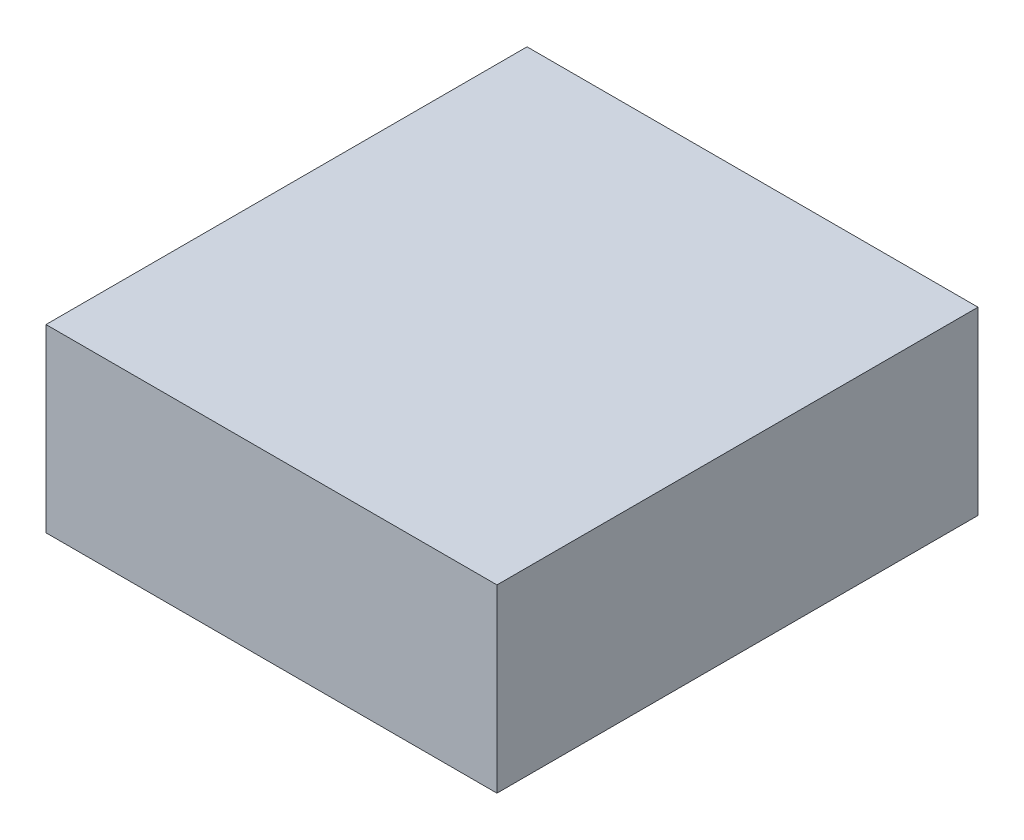
ISO-10303-21;
HEADER;
FILE_DESCRIPTION(('STEP AP214'),'2;1');
FILE_NAME('part.step','',(''),(''),'','','');
FILE_SCHEMA(('AUTOMOTIVE_DESIGN { 1 0 10303 214 1 1 1 1 }'));
ENDSEC;
DATA;
#1=APPLICATION_CONTEXT('core data for automotive mechanical design processes');
#2=APPLICATION_PROTOCOL_DEFINITION('international standard','automotive_design',2000,#1);
#3=PRODUCT_CONTEXT('',#1,'mechanical');
#4=PRODUCT('Part','Part','',(#3));
#5=PRODUCT_RELATED_PRODUCT_CATEGORY('part','',(#4));
#6=PRODUCT_DEFINITION_FORMATION('','',#4);
#7=PRODUCT_DEFINITION_CONTEXT('part definition',#1,'design');
#8=PRODUCT_DEFINITION('design','',#6,#7);
#9=PRODUCT_DEFINITION_SHAPE('','',#8);
#10=(LENGTH_UNIT() NAMED_UNIT(*) SI_UNIT(.MILLI.,.METRE.));
#11=(NAMED_UNIT(*) PLANE_ANGLE_UNIT() SI_UNIT($,.RADIAN.));
#12=(NAMED_UNIT(*) SI_UNIT($,.STERADIAN.) SOLID_ANGLE_UNIT());
#13=UNCERTAINTY_MEASURE_WITH_UNIT(LENGTH_MEASURE(1.E-05),#10,'distance_accuracy_value','');
#14=(GEOMETRIC_REPRESENTATION_CONTEXT(3) GLOBAL_UNCERTAINTY_ASSIGNED_CONTEXT((#13)) GLOBAL_UNIT_ASSIGNED_CONTEXT((#10,
#11,#12)) REPRESENTATION_CONTEXT('',''));
#15=CARTESIAN_POINT('',(0.,0.,0.));
#16=DIRECTION('',(0.,0.,1.));
#17=DIRECTION('',(1.,0.,0.));
#18=AXIS2_PLACEMENT_3D('',#15,#16,#17);
#19=CARTESIAN_POINT('',(15.,12.,-16.));
#20=DIRECTION('',(-1.,0.,0.));
#21=DIRECTION('',(0.,0.,1.));
#22=AXIS2_PLACEMENT_3D('',#19,#20,#21);
#23=PLANE('',#22);
#24=DIRECTION('',(0.,0.,-1.));
#25=VECTOR('',#24,1.);
#26=CARTESIAN_POINT('',(15.,0.,-16.));
#27=LINE('',#26,#25);
#28=CARTESIAN_POINT('',(15.,0.,16.));
#29=VERTEX_POINT('',#28);
#30=CARTESIAN_POINT('',(15.,0.,-16.));
#31=VERTEX_POINT('',#30);
#32=EDGE_CURVE('E95',#29,#31,#27,.T.);
#33=ORIENTED_EDGE('',*,*,#32,.T.);
#34=DIRECTION('',(0.,-1.,0.));
#35=VECTOR('',#34,1.);
#36=CARTESIAN_POINT('',(15.,12.,-16.));
#37=LINE('',#36,#35);
#38=CARTESIAN_POINT('',(15.,12.,-16.));
#39=VERTEX_POINT('',#38);
#40=EDGE_CURVE('E11',#39,#31,#37,.T.);
#41=ORIENTED_EDGE('',*,*,#40,.F.);
#42=DIRECTION('',(0.,0.,-1.));
#43=VECTOR('',#42,1.);
#44=CARTESIAN_POINT('',(15.,12.,-16.));
#45=LINE('',#44,#43);
#46=CARTESIAN_POINT('',(15.,12.,16.));
#47=VERTEX_POINT('',#46);
#48=EDGE_CURVE('E83',#47,#39,#45,.T.);
#49=ORIENTED_EDGE('',*,*,#48,.F.);
#50=DIRECTION('',(0.,-1.,0.));
#51=VECTOR('',#50,1.);
#52=CARTESIAN_POINT('',(15.,12.,16.));
#53=LINE('',#52,#51);
#54=EDGE_CURVE('E91',#47,#29,#53,.T.);
#55=ORIENTED_EDGE('',*,*,#54,.T.);
#56=EDGE_LOOP('',(#33,#41,#49,#55));
#57=FACE_BOUND('',#56,.T.);
#58=ADVANCED_FACE('F32',(#57),#23,.F.);
#59=CARTESIAN_POINT('',(-15.,12.,-16.));
#60=DIRECTION('',(0.,0.,1.));
#61=DIRECTION('',(1.,0.,0.));
#62=AXIS2_PLACEMENT_3D('',#59,#60,#61);
#63=PLANE('',#62);
#64=DIRECTION('',(-1.,0.,0.));
#65=VECTOR('',#64,1.);
#66=CARTESIAN_POINT('',(-15.,0.,-16.));
#67=LINE('',#66,#65);
#68=CARTESIAN_POINT('',(-15.,0.,-16.));
#69=VERTEX_POINT('',#68);
#70=EDGE_CURVE('E87',#31,#69,#67,.T.);
#71=ORIENTED_EDGE('',*,*,#70,.T.);
#72=DIRECTION('',(0.,-1.,0.));
#73=VECTOR('',#72,1.);
#74=CARTESIAN_POINT('',(-15.,12.,-16.));
#75=LINE('',#74,#73);
#76=CARTESIAN_POINT('',(-15.,12.,-16.));
#77=VERTEX_POINT('',#76);
#78=EDGE_CURVE('E40',#77,#69,#75,.T.);
#79=ORIENTED_EDGE('',*,*,#78,.F.);
#80=DIRECTION('',(-1.,0.,0.));
#81=VECTOR('',#80,1.);
#82=CARTESIAN_POINT('',(-15.,12.,-16.));
#83=LINE('',#82,#81);
#84=EDGE_CURVE('E78',#39,#77,#83,.T.);
#85=ORIENTED_EDGE('',*,*,#84,.F.);
#86=ORIENTED_EDGE('',*,*,#40,.T.);
#87=EDGE_LOOP('',(#71,#79,#85,#86));
#88=FACE_BOUND('',#87,.T.);
#89=ADVANCED_FACE('F86',(#88),#63,.F.);
#90=CARTESIAN_POINT('',(-15.,12.,-16.));
#91=DIRECTION('',(1.,0.,0.));
#92=DIRECTION('',(0.,0.,-1.));
#93=AXIS2_PLACEMENT_3D('',#90,#91,#92);
#94=PLANE('',#93);
#95=DIRECTION('',(0.,0.,1.));
#96=VECTOR('',#95,1.);
#97=CARTESIAN_POINT('',(-15.,0.,-16.));
#98=LINE('',#97,#96);
#99=CARTESIAN_POINT('',(-15.,0.,16.));
#100=VERTEX_POINT('',#99);
#101=EDGE_CURVE('E65',#69,#100,#98,.T.);
#102=ORIENTED_EDGE('',*,*,#101,.T.);
#103=DIRECTION('',(0.,-1.,0.));
#104=VECTOR('',#103,1.);
#105=CARTESIAN_POINT('',(-15.,12.,16.));
#106=LINE('',#105,#104);
#107=CARTESIAN_POINT('',(-15.,12.,16.));
#108=VERTEX_POINT('',#107);
#109=EDGE_CURVE('E88',#108,#100,#106,.T.);
#110=ORIENTED_EDGE('',*,*,#109,.F.);
#111=DIRECTION('',(0.,0.,1.));
#112=VECTOR('',#111,1.);
#113=CARTESIAN_POINT('',(-15.,12.,-16.));
#114=LINE('',#113,#112);
#115=EDGE_CURVE('E81',#77,#108,#114,.T.);
#116=ORIENTED_EDGE('',*,*,#115,.F.);
#117=ORIENTED_EDGE('',*,*,#78,.T.);
#118=EDGE_LOOP('',(#102,#110,#116,#117));
#119=FACE_BOUND('',#118,.T.);
#120=ADVANCED_FACE('F89',(#119),#94,.F.);
#121=CARTESIAN_POINT('',(-15.,12.,16.));
#122=DIRECTION('',(0.,0.,-1.));
#123=DIRECTION('',(-1.,0.,0.));
#124=AXIS2_PLACEMENT_3D('',#121,#122,#123);
#125=PLANE('',#124);
#126=DIRECTION('',(1.,0.,0.));
#127=VECTOR('',#126,1.);
#128=CARTESIAN_POINT('',(-15.,0.,16.));
#129=LINE('',#128,#127);
#130=EDGE_CURVE('E71',#100,#29,#129,.T.);
#131=ORIENTED_EDGE('',*,*,#130,.T.);
#132=ORIENTED_EDGE('',*,*,#54,.F.);
#133=DIRECTION('',(1.,0.,0.));
#134=VECTOR('',#133,1.);
#135=CARTESIAN_POINT('',(-15.,12.,16.));
#136=LINE('',#135,#134);
#137=EDGE_CURVE('E48',#108,#47,#136,.T.);
#138=ORIENTED_EDGE('',*,*,#137,.F.);
#139=ORIENTED_EDGE('',*,*,#109,.T.);
#140=EDGE_LOOP('',(#131,#132,#138,#139));
#141=FACE_BOUND('',#140,.T.);
#142=ADVANCED_FACE('F102',(#141),#125,.F.);
#143=CARTESIAN_POINT('',(0.,12.,0.));
#144=DIRECTION('',(0.,1.,0.));
#145=DIRECTION('',(0.,0.,1.));
#146=AXIS2_PLACEMENT_3D('',#143,#144,#145);
#147=PLANE('',#146);
#148=ORIENTED_EDGE('',*,*,#48,.T.);
#149=ORIENTED_EDGE('',*,*,#84,.T.);
#150=ORIENTED_EDGE('',*,*,#115,.T.);
#151=ORIENTED_EDGE('',*,*,#137,.T.);
#152=EDGE_LOOP('',(#148,#149,#150,#151));
#153=FACE_BOUND('',#152,.T.);
#154=ADVANCED_FACE('F79',(#153),#147,.T.);
#155=CARTESIAN_POINT('',(0.,0.,0.));
#156=DIRECTION('',(0.,1.,0.));
#157=DIRECTION('',(0.,0.,1.));
#158=AXIS2_PLACEMENT_3D('',#155,#156,#157);
#159=PLANE('',#158);
#160=ORIENTED_EDGE('',*,*,#32,.F.);
#161=ORIENTED_EDGE('',*,*,#130,.F.);
#162=ORIENTED_EDGE('',*,*,#101,.F.);
#163=ORIENTED_EDGE('',*,*,#70,.F.);
#164=EDGE_LOOP('',(#160,#161,#162,#163));
#165=FACE_BOUND('',#164,.T.);
#166=ADVANCED_FACE('F105',(#165),#159,.F.);
#167=CLOSED_SHELL('',(#58,#89,#120,#142,#154,#166));
#168=MANIFOLD_SOLID_BREP('B2',#167);
#169=ADVANCED_BREP_SHAPE_REPRESENTATION('',(#18,#168),#14);
#170=SHAPE_DEFINITION_REPRESENTATION(#9,#169);
ENDSEC;
END-ISO-10303-21;
